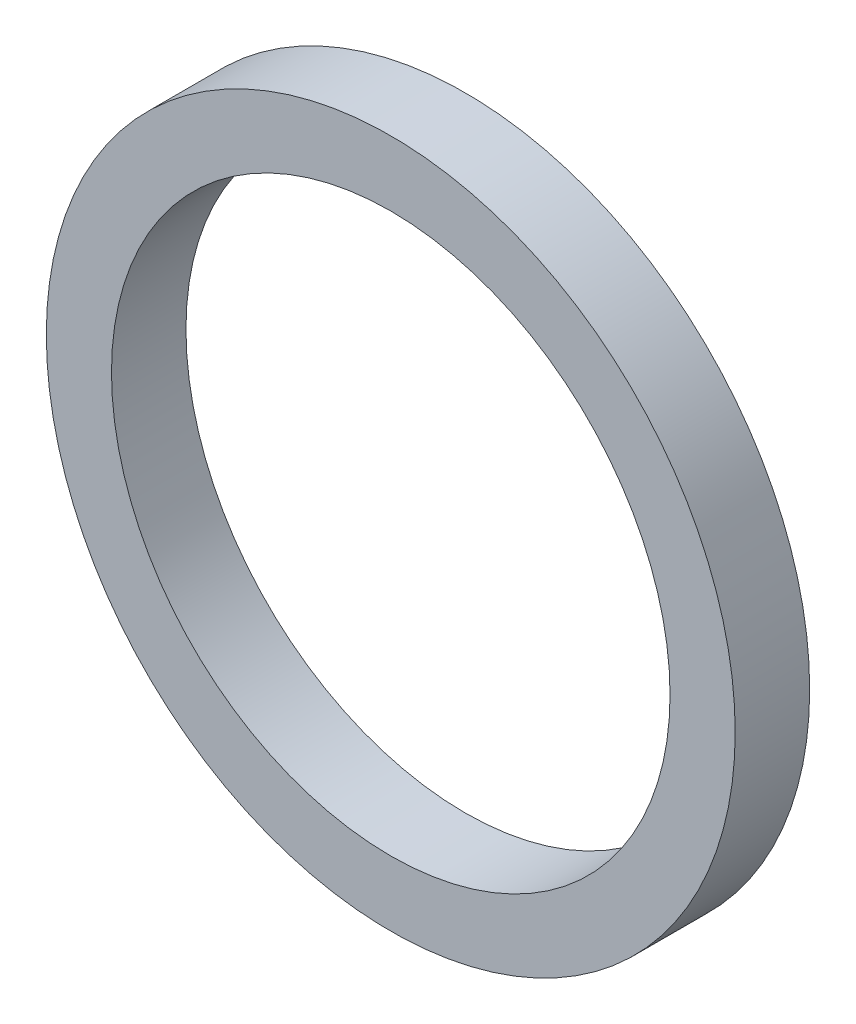
ISO-10303-21;
HEADER;
FILE_DESCRIPTION(('STEP AP214'),'2;1');
FILE_NAME('part.step','',(''),(''),'','','');
FILE_SCHEMA(('AUTOMOTIVE_DESIGN { 1 0 10303 214 1 1 1 1 }'));
ENDSEC;
DATA;
#1=APPLICATION_CONTEXT('core data for automotive mechanical design processes');
#2=APPLICATION_PROTOCOL_DEFINITION('international standard','automotive_design',2000,#1);
#3=PRODUCT_CONTEXT('',#1,'mechanical');
#4=PRODUCT('Part','Part','',(#3));
#5=PRODUCT_RELATED_PRODUCT_CATEGORY('part','',(#4));
#6=PRODUCT_DEFINITION_FORMATION('','',#4);
#7=PRODUCT_DEFINITION_CONTEXT('part definition',#1,'design');
#8=PRODUCT_DEFINITION('design','',#6,#7);
#9=PRODUCT_DEFINITION_SHAPE('','',#8);
#10=(LENGTH_UNIT() NAMED_UNIT(*) SI_UNIT(.MILLI.,.METRE.));
#11=(NAMED_UNIT(*) PLANE_ANGLE_UNIT() SI_UNIT($,.RADIAN.));
#12=(NAMED_UNIT(*) SI_UNIT($,.STERADIAN.) SOLID_ANGLE_UNIT());
#13=UNCERTAINTY_MEASURE_WITH_UNIT(LENGTH_MEASURE(1.E-05),#10,'distance_accuracy_value','');
#14=(GEOMETRIC_REPRESENTATION_CONTEXT(3) GLOBAL_UNCERTAINTY_ASSIGNED_CONTEXT((#13)) GLOBAL_UNIT_ASSIGNED_CONTEXT((#10,
#11,#12)) REPRESENTATION_CONTEXT('',''));
#15=CARTESIAN_POINT('',(0.,0.,0.));
#16=DIRECTION('',(0.,0.,1.));
#17=DIRECTION('',(1.,0.,0.));
#18=AXIS2_PLACEMENT_3D('',#15,#16,#17);
#19=CARTESIAN_POINT('',(0.,0.,4.));
#20=DIRECTION('',(0.,0.,1.));
#21=DIRECTION('',(1.,0.,0.));
#22=AXIS2_PLACEMENT_3D('',#19,#20,#21);
#23=PLANE('',#22);
#24=CARTESIAN_POINT('',(0.,0.,4.));
#25=DIRECTION('',(0.,0.,1.));
#26=DIRECTION('',(1.,0.,0.));
#27=AXIS2_PLACEMENT_3D('',#24,#25,#26);
#28=CIRCLE('',#27,18.5);
#29=CARTESIAN_POINT('',(18.5,0.,4.));
#30=VERTEX_POINT('',#29);
#31=EDGE_CURVE('E10',#30,#30,#28,.T.);
#32=ORIENTED_EDGE('',*,*,#31,.T.);
#33=EDGE_LOOP('',(#32));
#34=FACE_BOUND('',#33,.T.);
#35=CARTESIAN_POINT('',(0.,0.,4.));
#36=DIRECTION('',(0.,0.,1.));
#37=DIRECTION('',(1.,0.,0.));
#38=AXIS2_PLACEMENT_3D('',#35,#36,#37);
#39=CIRCLE('',#38,15.);
#40=CARTESIAN_POINT('',(15.,0.,4.));
#41=VERTEX_POINT('',#40);
#42=EDGE_CURVE('E50',#41,#41,#39,.T.);
#43=ORIENTED_EDGE('',*,*,#42,.F.);
#44=EDGE_LOOP('',(#43));
#45=FACE_BOUND('',#44,.T.);
#46=ADVANCED_FACE('F37',(#34,#45),#23,.T.);
#47=CARTESIAN_POINT('',(0.,0.,0.));
#48=DIRECTION('',(0.,0.,1.));
#49=DIRECTION('',(1.,0.,0.));
#50=AXIS2_PLACEMENT_3D('',#47,#48,#49);
#51=PLANE('',#50);
#52=CARTESIAN_POINT('',(0.,0.,0.));
#53=DIRECTION('',(0.,0.,1.));
#54=DIRECTION('',(1.,0.,0.));
#55=AXIS2_PLACEMENT_3D('',#52,#53,#54);
#56=CIRCLE('',#55,18.5);
#57=CARTESIAN_POINT('',(18.5,0.,0.));
#58=VERTEX_POINT('',#57);
#59=EDGE_CURVE('E41',#58,#58,#56,.T.);
#60=ORIENTED_EDGE('',*,*,#59,.F.);
#61=EDGE_LOOP('',(#60));
#62=FACE_BOUND('',#61,.T.);
#63=CARTESIAN_POINT('',(0.,0.,0.));
#64=DIRECTION('',(0.,0.,1.));
#65=DIRECTION('',(1.,0.,0.));
#66=AXIS2_PLACEMENT_3D('',#63,#64,#65);
#67=CIRCLE('',#66,15.);
#68=CARTESIAN_POINT('',(15.,0.,0.));
#69=VERTEX_POINT('',#68);
#70=EDGE_CURVE('E52',#69,#69,#67,.T.);
#71=ORIENTED_EDGE('',*,*,#70,.T.);
#72=EDGE_LOOP('',(#71));
#73=FACE_BOUND('',#72,.T.);
#74=ADVANCED_FACE('F64',(#62,#73),#51,.F.);
#75=CARTESIAN_POINT('',(0.,0.,4.));
#76=DIRECTION('',(0.,0.,-1.));
#77=DIRECTION('',(-1.,0.,0.));
#78=AXIS2_PLACEMENT_3D('',#75,#76,#77);
#79=CYLINDRICAL_SURFACE('',#78,18.5);
#80=ORIENTED_EDGE('',*,*,#31,.F.);
#81=EDGE_LOOP('',(#80));
#82=FACE_BOUND('',#81,.T.);
#83=ORIENTED_EDGE('',*,*,#59,.T.);
#84=EDGE_LOOP('',(#83));
#85=FACE_BOUND('',#84,.T.);
#86=ADVANCED_FACE('F39',(#82,#85),#79,.T.);
#87=CARTESIAN_POINT('',(0.,0.,4.));
#88=DIRECTION('',(0.,0.,-1.));
#89=DIRECTION('',(-1.,0.,0.));
#90=AXIS2_PLACEMENT_3D('',#87,#88,#89);
#91=CYLINDRICAL_SURFACE('',#90,15.);
#92=ORIENTED_EDGE('',*,*,#42,.T.);
#93=EDGE_LOOP('',(#92));
#94=FACE_BOUND('',#93,.T.);
#95=ORIENTED_EDGE('',*,*,#70,.F.);
#96=EDGE_LOOP('',(#95));
#97=FACE_BOUND('',#96,.T.);
#98=ADVANCED_FACE('F60',(#94,#97),#91,.F.);
#99=CLOSED_SHELL('',(#46,#74,#86,#98));
#100=MANIFOLD_SOLID_BREP('B2',#99);
#101=ADVANCED_BREP_SHAPE_REPRESENTATION('',(#18,#100),#14);
#102=SHAPE_DEFINITION_REPRESENTATION(#9,#101);
ENDSEC;
END-ISO-10303-21;
